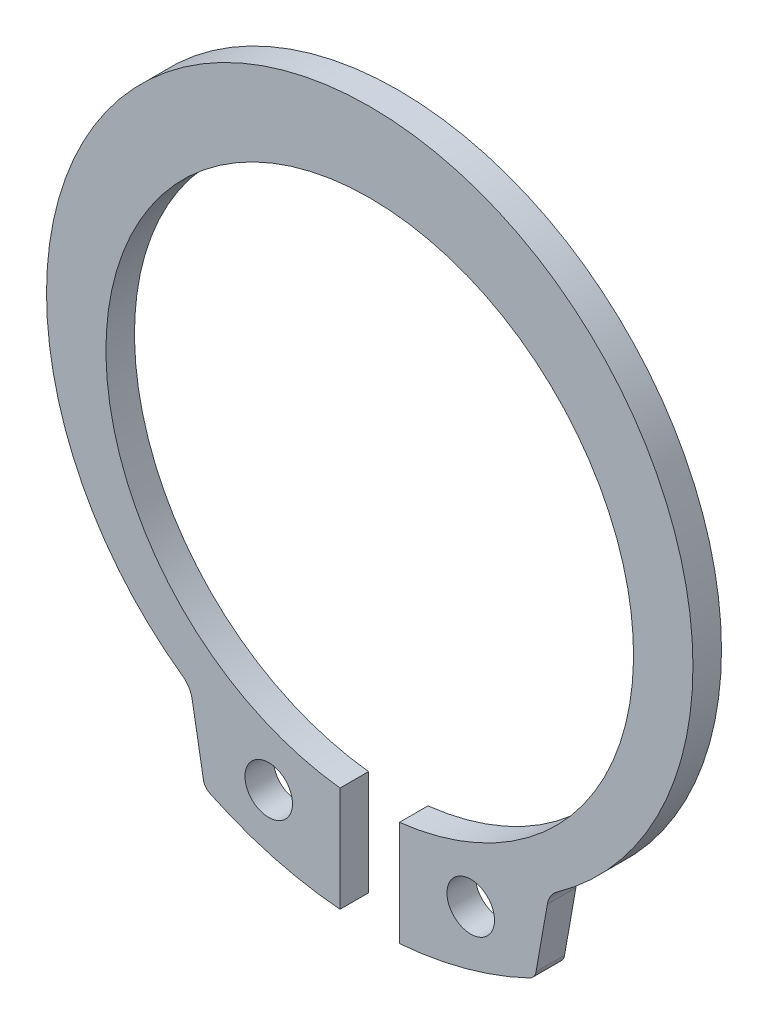
ISO-10303-21;
HEADER;
FILE_DESCRIPTION(('STEP AP214'),'2;1');
FILE_NAME('part.step','',(''),(''),'','','');
FILE_SCHEMA(('AUTOMOTIVE_DESIGN { 1 0 10303 214 1 1 1 1 }'));
ENDSEC;
DATA;
#1=APPLICATION_CONTEXT('core data for automotive mechanical design processes');
#2=APPLICATION_PROTOCOL_DEFINITION('international standard','automotive_design',2000,#1);
#3=PRODUCT_CONTEXT('',#1,'mechanical');
#4=PRODUCT('Part','Part','',(#3));
#5=PRODUCT_RELATED_PRODUCT_CATEGORY('part','',(#4));
#6=PRODUCT_DEFINITION_FORMATION('','',#4);
#7=PRODUCT_DEFINITION_CONTEXT('part definition',#1,'design');
#8=PRODUCT_DEFINITION('design','',#6,#7);
#9=PRODUCT_DEFINITION_SHAPE('','',#8);
#10=(LENGTH_UNIT() NAMED_UNIT(*) SI_UNIT(.MILLI.,.METRE.));
#11=(NAMED_UNIT(*) PLANE_ANGLE_UNIT() SI_UNIT($,.RADIAN.));
#12=(NAMED_UNIT(*) SI_UNIT($,.STERADIAN.) SOLID_ANGLE_UNIT());
#13=UNCERTAINTY_MEASURE_WITH_UNIT(LENGTH_MEASURE(1.E-05),#10,'distance_accuracy_value','');
#14=(GEOMETRIC_REPRESENTATION_CONTEXT(3) GLOBAL_UNCERTAINTY_ASSIGNED_CONTEXT((#13)) GLOBAL_UNIT_ASSIGNED_CONTEXT((#10,
#11,#12)) REPRESENTATION_CONTEXT('',''));
#15=CARTESIAN_POINT('',(0.,0.,0.));
#16=DIRECTION('',(0.,0.,1.));
#17=DIRECTION('',(1.,0.,0.));
#18=AXIS2_PLACEMENT_3D('',#15,#16,#17);
#19=CARTESIAN_POINT('',(0.,-0.2075,-0.3));
#20=DIRECTION('',(0.,0.,1.));
#21=DIRECTION('',(1.,0.,0.));
#22=AXIS2_PLACEMENT_3D('',#19,#20,#21);
#23=CYLINDRICAL_SURFACE('',#22,3.875);
#24=CARTESIAN_POINT('',(0.,-0.2075,-0.3));
#25=DIRECTION('',(0.,0.,1.));
#26=DIRECTION('',(-1.,0.,0.));
#27=AXIS2_PLACEMENT_3D('',#24,#25,#26);
#28=CIRCLE('',#27,3.875);
#29=CARTESIAN_POINT('',(0.3125,-4.06987863887009,-0.3));
#30=VERTEX_POINT('',#29);
#31=CARTESIAN_POINT('',(1.68036051645783,-3.69920639297315,-0.3));
#32=VERTEX_POINT('',#31);
#33=EDGE_CURVE('E178',#30,#32,#28,.T.);
#34=ORIENTED_EDGE('',*,*,#33,.T.);
#35=DIRECTION('',(0.,0.,1.));
#36=VECTOR('',#35,1.);
#37=CARTESIAN_POINT('',(1.68036051645783,-3.69920639297315,-0.3));
#38=LINE('',#37,#36);
#39=CARTESIAN_POINT('',(1.68036051645783,-3.69920639297315,0.));
#40=VERTEX_POINT('',#39);
#41=EDGE_CURVE('E196',#32,#40,#38,.T.);
#42=ORIENTED_EDGE('',*,*,#41,.T.);
#43=CARTESIAN_POINT('',(0.,-0.2075,0.));
#44=DIRECTION('',(0.,0.,1.));
#45=DIRECTION('',(-1.,0.,0.));
#46=AXIS2_PLACEMENT_3D('',#43,#44,#45);
#47=CIRCLE('',#46,3.875);
#48=CARTESIAN_POINT('',(0.3125,-4.06987863887009,0.));
#49=VERTEX_POINT('',#48);
#50=EDGE_CURVE('E158',#49,#40,#47,.T.);
#51=ORIENTED_EDGE('',*,*,#50,.F.);
#52=DIRECTION('',(0.,0.,1.));
#53=VECTOR('',#52,1.);
#54=CARTESIAN_POINT('',(0.3125,-4.06987863887009,-0.3));
#55=LINE('',#54,#53);
#56=EDGE_CURVE('E179',#30,#49,#55,.T.);
#57=ORIENTED_EDGE('',*,*,#56,.F.);
#58=EDGE_LOOP('',(#34,#42,#51,#57));
#59=FACE_BOUND('',#58,.T.);
#60=ADVANCED_FACE('F37',(#59),#23,.T.);
#61=CARTESIAN_POINT('',(0.3125,-2.96484813725072,-0.3));
#62=DIRECTION('',(-1.,0.,0.));
#63=DIRECTION('',(0.,-1.,0.));
#64=AXIS2_PLACEMENT_3D('',#61,#62,#63);
#65=PLANE('',#64);
#66=DIRECTION('',(0.,-1.,0.));
#67=VECTOR('',#66,1.);
#68=CARTESIAN_POINT('',(0.3125,-2.96484813725072,0.));
#69=LINE('',#68,#67);
#70=CARTESIAN_POINT('',(0.3125,-2.96484813725072,0.));
#71=VERTEX_POINT('',#70);
#72=EDGE_CURVE('E175',#71,#49,#69,.T.);
#73=ORIENTED_EDGE('',*,*,#72,.F.);
#74=DIRECTION('',(0.,0.,1.));
#75=VECTOR('',#74,1.);
#76=CARTESIAN_POINT('',(0.3125,-2.96484813725072,-0.3));
#77=LINE('',#76,#75);
#78=CARTESIAN_POINT('',(0.3125,-2.96484813725072,-0.3));
#79=VERTEX_POINT('',#78);
#80=EDGE_CURVE('E182',#79,#71,#77,.T.);
#81=ORIENTED_EDGE('',*,*,#80,.F.);
#82=DIRECTION('',(0.,-1.,0.));
#83=VECTOR('',#82,1.);
#84=CARTESIAN_POINT('',(0.3125,-2.96484813725072,-0.3));
#85=LINE('',#84,#83);
#86=EDGE_CURVE('E145',#79,#30,#85,.T.);
#87=ORIENTED_EDGE('',*,*,#86,.T.);
#88=ORIENTED_EDGE('',*,*,#56,.T.);
#89=EDGE_LOOP('',(#73,#81,#87,#88));
#90=FACE_BOUND('',#89,.T.);
#91=ADVANCED_FACE('F277',(#90),#65,.T.);
#92=CARTESIAN_POINT('',(0.,-0.2075,-0.3));
#93=DIRECTION('',(0.,0.,1.));
#94=DIRECTION('',(1.,0.,0.));
#95=AXIS2_PLACEMENT_3D('',#92,#93,#94);
#96=CYLINDRICAL_SURFACE('',#95,2.775);
#97=CARTESIAN_POINT('',(0.,-0.2075,0.));
#98=DIRECTION('',(0.,0.,-1.));
#99=DIRECTION('',(1.,0.,0.));
#100=AXIS2_PLACEMENT_3D('',#97,#98,#99);
#101=CIRCLE('',#100,2.775);
#102=CARTESIAN_POINT('',(-0.312499999999999,-2.96484813725072,0.));
#103=VERTEX_POINT('',#102);
#104=EDGE_CURVE('E172',#103,#71,#101,.T.);
#105=ORIENTED_EDGE('',*,*,#104,.F.);
#106=DIRECTION('',(0.,0.,1.));
#107=VECTOR('',#106,1.);
#108=CARTESIAN_POINT('',(-0.312499999999999,-2.96484813725072,-0.3));
#109=LINE('',#108,#107);
#110=CARTESIAN_POINT('',(-0.312499999999999,-2.96484813725072,-0.3));
#111=VERTEX_POINT('',#110);
#112=EDGE_CURVE('E144',#111,#103,#109,.T.);
#113=ORIENTED_EDGE('',*,*,#112,.F.);
#114=CARTESIAN_POINT('',(0.,-0.2075,-0.3));
#115=DIRECTION('',(0.,0.,-1.));
#116=DIRECTION('',(1.,0.,0.));
#117=AXIS2_PLACEMENT_3D('',#114,#115,#116);
#118=CIRCLE('',#117,2.775);
#119=EDGE_CURVE('E151',#111,#79,#118,.T.);
#120=ORIENTED_EDGE('',*,*,#119,.T.);
#121=ORIENTED_EDGE('',*,*,#80,.T.);
#122=EDGE_LOOP('',(#105,#113,#120,#121));
#123=FACE_BOUND('',#122,.T.);
#124=ADVANCED_FACE('F283',(#123),#96,.F.);
#125=CARTESIAN_POINT('',(-0.3125,-2.96484813725072,-0.3));
#126=DIRECTION('',(1.,0.,0.));
#127=DIRECTION('',(0.,1.,0.));
#128=AXIS2_PLACEMENT_3D('',#125,#126,#127);
#129=PLANE('',#128);
#130=DIRECTION('',(0.,1.,0.));
#131=VECTOR('',#130,1.);
#132=CARTESIAN_POINT('',(-0.3125,-2.96484813725072,0.));
#133=LINE('',#132,#131);
#134=CARTESIAN_POINT('',(-0.3125,-4.06987863887009,0.));
#135=VERTEX_POINT('',#134);
#136=EDGE_CURVE('E143',#135,#103,#133,.T.);
#137=ORIENTED_EDGE('',*,*,#136,.F.);
#138=DIRECTION('',(0.,0.,1.));
#139=VECTOR('',#138,1.);
#140=CARTESIAN_POINT('',(-0.3125,-4.06987863887009,-0.3));
#141=LINE('',#140,#139);
#142=CARTESIAN_POINT('',(-0.3125,-4.06987863887009,-0.3));
#143=VERTEX_POINT('',#142);
#144=EDGE_CURVE('E128',#143,#135,#141,.T.);
#145=ORIENTED_EDGE('',*,*,#144,.F.);
#146=DIRECTION('',(0.,1.,0.));
#147=VECTOR('',#146,1.);
#148=CARTESIAN_POINT('',(-0.3125,-2.96484813725072,-0.3));
#149=LINE('',#148,#147);
#150=EDGE_CURVE('E136',#143,#111,#149,.T.);
#151=ORIENTED_EDGE('',*,*,#150,.T.);
#152=ORIENTED_EDGE('',*,*,#112,.T.);
#153=EDGE_LOOP('',(#137,#145,#151,#152));
#154=FACE_BOUND('',#153,.T.);
#155=ADVANCED_FACE('F141',(#154),#129,.T.);
#156=CARTESIAN_POINT('',(0.,-0.2075,-0.3));
#157=DIRECTION('',(0.,0.,1.));
#158=DIRECTION('',(1.,0.,0.));
#159=AXIS2_PLACEMENT_3D('',#156,#157,#158);
#160=CYLINDRICAL_SURFACE('',#159,3.875);
#161=CARTESIAN_POINT('',(0.,-0.2075,0.));
#162=DIRECTION('',(0.,0.,1.));
#163=DIRECTION('',(1.,0.,0.));
#164=AXIS2_PLACEMENT_3D('',#161,#162,#163);
#165=CIRCLE('',#164,3.875);
#166=CARTESIAN_POINT('',(-1.68036051645783,-3.69920639297315,0.));
#167=VERTEX_POINT('',#166);
#168=EDGE_CURVE('E169',#167,#135,#165,.T.);
#169=ORIENTED_EDGE('',*,*,#168,.F.);
#170=DIRECTION('',(0.,0.,1.));
#171=VECTOR('',#170,1.);
#172=CARTESIAN_POINT('',(-1.68036051645783,-3.69920639297315,-0.3));
#173=LINE('',#172,#171);
#174=CARTESIAN_POINT('',(-1.68036051645783,-3.69920639297315,-0.3));
#175=VERTEX_POINT('',#174);
#176=EDGE_CURVE('E131',#167,#175,#173,.F.);
#177=ORIENTED_EDGE('',*,*,#176,.T.);
#178=CARTESIAN_POINT('',(0.,-0.2075,-0.3));
#179=DIRECTION('',(0.,0.,1.));
#180=DIRECTION('',(1.,0.,0.));
#181=AXIS2_PLACEMENT_3D('',#178,#179,#180);
#182=CIRCLE('',#181,3.875);
#183=EDGE_CURVE('E124',#175,#143,#182,.T.);
#184=ORIENTED_EDGE('',*,*,#183,.T.);
#185=ORIENTED_EDGE('',*,*,#144,.T.);
#186=EDGE_LOOP('',(#169,#177,#184,#185));
#187=FACE_BOUND('',#186,.T.);
#188=ADVANCED_FACE('F127',(#187),#160,.T.);
#189=CARTESIAN_POINT('',(-1.88676064825309,-2.82845085801461,-0.3));
#190=DIRECTION('',(-0.984807753012208,-0.173648177666931,0.));
#191=DIRECTION('',(0.173648177666931,-0.984807753012208,0.));
#192=AXIS2_PLACEMENT_3D('',#189,#190,#191);
#193=PLANE('',#192);
#194=DIRECTION('',(0.173648177666931,-0.984807753012208,0.));
#195=VECTOR('',#194,1.);
#196=CARTESIAN_POINT('',(-1.88676064825309,-2.82845085801461,0.));
#197=LINE('',#196,#195);
#198=CARTESIAN_POINT('',(-1.86858853891758,-2.9315100113132,0.));
#199=VERTEX_POINT('',#198);
#200=CARTESIAN_POINT('',(-1.7492563076341,-3.60827672508561,0.));
#201=VERTEX_POINT('',#200);
#202=EDGE_CURVE('E167',#199,#201,#197,.T.);
#203=ORIENTED_EDGE('',*,*,#202,.F.);
#204=DIRECTION('',(0.,0.,-1.));
#205=VECTOR('',#204,1.);
#206=CARTESIAN_POINT('',(-1.86858853891758,-2.9315100113132,-0.3));
#207=LINE('',#206,#205);
#208=CARTESIAN_POINT('',(-1.86858853891758,-2.9315100113132,-0.3));
#209=VERTEX_POINT('',#208);
#210=EDGE_CURVE('E58',#199,#209,#207,.T.);
#211=ORIENTED_EDGE('',*,*,#210,.T.);
#212=DIRECTION('',(0.173648177666931,-0.984807753012208,0.));
#213=VECTOR('',#212,1.);
#214=CARTESIAN_POINT('',(-1.88676064825309,-2.82845085801461,-0.3));
#215=LINE('',#214,#213);
#216=CARTESIAN_POINT('',(-1.7492563076341,-3.60827672508561,-0.3));
#217=VERTEX_POINT('',#216);
#218=EDGE_CURVE('E137',#209,#217,#215,.T.);
#219=ORIENTED_EDGE('',*,*,#218,.T.);
#220=DIRECTION('',(0.,0.,1.));
#221=VECTOR('',#220,1.);
#222=CARTESIAN_POINT('',(-1.7492563076341,-3.60827672508561,-0.3));
#223=LINE('',#222,#221);
#224=EDGE_CURVE('E181',#217,#201,#223,.T.);
#225=ORIENTED_EDGE('',*,*,#224,.T.);
#226=EDGE_LOOP('',(#203,#211,#219,#225));
#227=FACE_BOUND('',#226,.T.);
#228=ADVANCED_FACE('F356',(#227),#193,.T.);
#229=CARTESIAN_POINT('',(0.,0.,-0.3));
#230=DIRECTION('',(0.,0.,1.));
#231=DIRECTION('',(1.,0.,0.));
#232=AXIS2_PLACEMENT_3D('',#229,#230,#231);
#233=CYLINDRICAL_SURFACE('',#232,3.4);
#234=CARTESIAN_POINT('',(0.,0.,0.));
#235=DIRECTION('',(0.,0.,1.));
#236=DIRECTION('',(1.,0.,0.));
#237=AXIS2_PLACEMENT_3D('',#234,#235,#236);
#238=CIRCLE('',#237,3.4);
#239=CARTESIAN_POINT('',(1.96994181435073,-2.77116027109089,0.));
#240=VERTEX_POINT('',#239);
#241=CARTESIAN_POINT('',(-1.96994181435073,-2.77116027109089,0.));
#242=VERTEX_POINT('',#241);
#243=EDGE_CURVE('E165',#240,#242,#238,.T.);
#244=ORIENTED_EDGE('',*,*,#243,.F.);
#245=DIRECTION('',(0.,0.,1.));
#246=VECTOR('',#245,1.);
#247=CARTESIAN_POINT('',(1.96994181435073,-2.77116027109089,-0.3));
#248=LINE('',#247,#246);
#249=CARTESIAN_POINT('',(1.96994181435073,-2.77116027109089,-0.3));
#250=VERTEX_POINT('',#249);
#251=EDGE_CURVE('E207',#240,#250,#248,.F.);
#252=ORIENTED_EDGE('',*,*,#251,.T.);
#253=CARTESIAN_POINT('',(0.,0.,-0.3));
#254=DIRECTION('',(0.,0.,1.));
#255=DIRECTION('',(1.,0.,0.));
#256=AXIS2_PLACEMENT_3D('',#253,#254,#255);
#257=CIRCLE('',#256,3.4);
#258=CARTESIAN_POINT('',(-1.96994181435073,-2.77116027109089,-0.3));
#259=VERTEX_POINT('',#258);
#260=EDGE_CURVE('E220',#250,#259,#257,.T.);
#261=ORIENTED_EDGE('',*,*,#260,.T.);
#262=DIRECTION('',(0.,0.,1.));
#263=VECTOR('',#262,1.);
#264=CARTESIAN_POINT('',(-1.96994181435073,-2.77116027109089,-0.3));
#265=LINE('',#264,#263);
#266=EDGE_CURVE('E204',#259,#242,#265,.T.);
#267=ORIENTED_EDGE('',*,*,#266,.T.);
#268=EDGE_LOOP('',(#244,#252,#261,#267));
#269=FACE_BOUND('',#268,.T.);
#270=ADVANCED_FACE('F233',(#269),#233,.T.);
#271=CARTESIAN_POINT('',(1.88676064825309,-2.82845085801461,-0.3));
#272=DIRECTION('',(0.984807753012208,-0.173648177666931,0.));
#273=DIRECTION('',(0.173648177666931,0.984807753012208,0.));
#274=AXIS2_PLACEMENT_3D('',#271,#272,#273);
#275=PLANE('',#274);
#276=DIRECTION('',(0.173648177666931,0.984807753012208,0.));
#277=VECTOR('',#276,1.);
#278=CARTESIAN_POINT('',(1.88676064825309,-2.82845085801461,-0.3));
#279=LINE('',#278,#277);
#280=CARTESIAN_POINT('',(1.7492563076341,-3.60827672508561,-0.3));
#281=VERTEX_POINT('',#280);
#282=CARTESIAN_POINT('',(1.86858853891758,-2.9315100113132,-0.3));
#283=VERTEX_POINT('',#282);
#284=EDGE_CURVE('E217',#281,#283,#279,.T.);
#285=ORIENTED_EDGE('',*,*,#284,.T.);
#286=DIRECTION('',(0.,0.,-1.));
#287=VECTOR('',#286,1.);
#288=CARTESIAN_POINT('',(1.86858853891758,-2.9315100113132,0.));
#289=LINE('',#288,#287);
#290=CARTESIAN_POINT('',(1.86858853891758,-2.9315100113132,0.));
#291=VERTEX_POINT('',#290);
#292=EDGE_CURVE('E201',#283,#291,#289,.F.);
#293=ORIENTED_EDGE('',*,*,#292,.T.);
#294=DIRECTION('',(0.173648177666931,0.984807753012208,0.));
#295=VECTOR('',#294,1.);
#296=CARTESIAN_POINT('',(1.88676064825309,-2.82845085801461,0.));
#297=LINE('',#296,#295);
#298=CARTESIAN_POINT('',(1.7492563076341,-3.60827672508561,0.));
#299=VERTEX_POINT('',#298);
#300=EDGE_CURVE('E161',#299,#291,#297,.T.);
#301=ORIENTED_EDGE('',*,*,#300,.F.);
#302=DIRECTION('',(0.,0.,1.));
#303=VECTOR('',#302,1.);
#304=CARTESIAN_POINT('',(1.7492563076341,-3.60827672508561,-0.3));
#305=LINE('',#304,#303);
#306=EDGE_CURVE('E199',#299,#281,#305,.F.);
#307=ORIENTED_EDGE('',*,*,#306,.T.);
#308=EDGE_LOOP('',(#285,#293,#301,#307));
#309=FACE_BOUND('',#308,.T.);
#310=ADVANCED_FACE('F225',(#309),#275,.T.);
#311=CARTESIAN_POINT('',(0.,-0.2075,-0.3));
#312=DIRECTION('',(0.,0.,-1.));
#313=DIRECTION('',(-1.,0.,0.));
#314=AXIS2_PLACEMENT_3D('',#311,#312,#313);
#315=PLANE('',#314);
#316=CARTESIAN_POINT('',(1.0625,-3.35816957169425,-0.3));
#317=DIRECTION('',(0.,0.,1.));
#318=DIRECTION('',(-1.,0.,0.));
#319=AXIS2_PLACEMENT_3D('',#316,#317,#318);
#320=CIRCLE('',#319,0.25);
#321=CARTESIAN_POINT('',(0.8125,-3.35816957169425,-0.3));
#322=VERTEX_POINT('',#321);
#323=EDGE_CURVE('E245',#322,#322,#320,.T.);
#324=ORIENTED_EDGE('',*,*,#323,.T.);
#325=EDGE_LOOP('',(#324));
#326=FACE_BOUND('',#325,.T.);
#327=CARTESIAN_POINT('',(-1.0625,-3.35816957169425,-0.3));
#328=DIRECTION('',(0.,0.,1.));
#329=DIRECTION('',(1.,0.,0.));
#330=AXIS2_PLACEMENT_3D('',#327,#328,#329);
#331=CIRCLE('',#330,0.25);
#332=CARTESIAN_POINT('',(-0.8125,-3.35816957169425,-0.3));
#333=VERTEX_POINT('',#332);
#334=EDGE_CURVE('E162',#333,#333,#331,.T.);
#335=ORIENTED_EDGE('',*,*,#334,.T.);
#336=EDGE_LOOP('',(#335));
#337=FACE_BOUND('',#336,.T.);
#338=ORIENTED_EDGE('',*,*,#183,.F.);
#339=CARTESIAN_POINT('',(-1.62615533850758,-3.58657070287724,-0.3));
#340=DIRECTION('',(0.,0.,-1.));
#341=DIRECTION('',(-1.,0.,0.));
#342=AXIS2_PLACEMENT_3D('',#339,#340,#341);
#343=CIRCLE('',#342,0.125);
#344=EDGE_CURVE('E194',#175,#217,#343,.T.);
#345=ORIENTED_EDGE('',*,*,#344,.T.);
#346=ORIENTED_EDGE('',*,*,#218,.F.);
#347=CARTESIAN_POINT('',(-2.11479047717063,-2.97492205572993,-0.3));
#348=DIRECTION('',(0.,0.,-1.));
#349=DIRECTION('',(-1.,0.,0.));
#350=AXIS2_PLACEMENT_3D('',#347,#348,#349);
#351=CIRCLE('',#350,0.25);
#352=EDGE_CURVE('E11',#209,#259,#351,.F.);
#353=ORIENTED_EDGE('',*,*,#352,.T.);
#354=ORIENTED_EDGE('',*,*,#260,.F.);
#355=CARTESIAN_POINT('',(2.11479047717063,-2.97492205572993,-0.3));
#356=DIRECTION('',(0.,0.,-1.));
#357=DIRECTION('',(-1.,0.,0.));
#358=AXIS2_PLACEMENT_3D('',#355,#356,#357);
#359=CIRCLE('',#358,0.25);
#360=EDGE_CURVE('E212',#250,#283,#359,.F.);
#361=ORIENTED_EDGE('',*,*,#360,.T.);
#362=ORIENTED_EDGE('',*,*,#284,.F.);
#363=CARTESIAN_POINT('',(1.62615533850758,-3.58657070287724,-0.3));
#364=DIRECTION('',(0.,0.,-1.));
#365=DIRECTION('',(-1.,0.,0.));
#366=AXIS2_PLACEMENT_3D('',#363,#364,#365);
#367=CIRCLE('',#366,0.125);
#368=EDGE_CURVE('E192',#281,#32,#367,.T.);
#369=ORIENTED_EDGE('',*,*,#368,.T.);
#370=ORIENTED_EDGE('',*,*,#33,.F.);
#371=ORIENTED_EDGE('',*,*,#86,.F.);
#372=ORIENTED_EDGE('',*,*,#119,.F.);
#373=ORIENTED_EDGE('',*,*,#150,.F.);
#374=EDGE_LOOP('',(#338,#345,#346,#353,#354,#361,#362,#369,#370,#371,#372,#373));
#375=FACE_BOUND('',#374,.T.);
#376=ADVANCED_FACE('F148',(#326,#337,#375),#315,.T.);
#377=CARTESIAN_POINT('',(0.,-0.2075,0.));
#378=DIRECTION('',(0.,0.,-1.));
#379=DIRECTION('',(-1.,0.,0.));
#380=AXIS2_PLACEMENT_3D('',#377,#378,#379);
#381=PLANE('',#380);
#382=CARTESIAN_POINT('',(1.0625,-3.35816957169425,0.));
#383=DIRECTION('',(0.,0.,1.));
#384=DIRECTION('',(-1.,0.,0.));
#385=AXIS2_PLACEMENT_3D('',#382,#383,#384);
#386=CIRCLE('',#385,0.25);
#387=CARTESIAN_POINT('',(0.8125,-3.35816957169425,0.));
#388=VERTEX_POINT('',#387);
#389=EDGE_CURVE('E248',#388,#388,#386,.T.);
#390=ORIENTED_EDGE('',*,*,#389,.F.);
#391=EDGE_LOOP('',(#390));
#392=FACE_BOUND('',#391,.T.);
#393=CARTESIAN_POINT('',(-1.0625,-3.35816957169425,0.));
#394=DIRECTION('',(0.,0.,1.));
#395=DIRECTION('',(1.,0.,0.));
#396=AXIS2_PLACEMENT_3D('',#393,#394,#395);
#397=CIRCLE('',#396,0.25);
#398=CARTESIAN_POINT('',(-0.8125,-3.35816957169425,0.));
#399=VERTEX_POINT('',#398);
#400=EDGE_CURVE('E242',#399,#399,#397,.T.);
#401=ORIENTED_EDGE('',*,*,#400,.F.);
#402=EDGE_LOOP('',(#401));
#403=FACE_BOUND('',#402,.T.);
#404=ORIENTED_EDGE('',*,*,#243,.T.);
#405=CARTESIAN_POINT('',(-2.11479047717063,-2.97492205572993,0.));
#406=DIRECTION('',(0.,0.,-1.));
#407=DIRECTION('',(-1.,0.,0.));
#408=AXIS2_PLACEMENT_3D('',#405,#406,#407);
#409=CIRCLE('',#408,0.25);
#410=EDGE_CURVE('E45',#242,#199,#409,.T.);
#411=ORIENTED_EDGE('',*,*,#410,.T.);
#412=ORIENTED_EDGE('',*,*,#202,.T.);
#413=CARTESIAN_POINT('',(-1.62615533850758,-3.58657070287724,0.));
#414=DIRECTION('',(0.,0.,-1.));
#415=DIRECTION('',(-1.,0.,0.));
#416=AXIS2_PLACEMENT_3D('',#413,#414,#415);
#417=CIRCLE('',#416,0.125);
#418=EDGE_CURVE('E189',#201,#167,#417,.F.);
#419=ORIENTED_EDGE('',*,*,#418,.T.);
#420=ORIENTED_EDGE('',*,*,#168,.T.);
#421=ORIENTED_EDGE('',*,*,#136,.T.);
#422=ORIENTED_EDGE('',*,*,#104,.T.);
#423=ORIENTED_EDGE('',*,*,#72,.T.);
#424=ORIENTED_EDGE('',*,*,#50,.T.);
#425=CARTESIAN_POINT('',(1.62615533850758,-3.58657070287724,0.));
#426=DIRECTION('',(0.,0.,-1.));
#427=DIRECTION('',(-1.,0.,0.));
#428=AXIS2_PLACEMENT_3D('',#425,#426,#427);
#429=CIRCLE('',#428,0.125);
#430=EDGE_CURVE('E187',#40,#299,#429,.F.);
#431=ORIENTED_EDGE('',*,*,#430,.T.);
#432=ORIENTED_EDGE('',*,*,#300,.T.);
#433=CARTESIAN_POINT('',(2.11479047717063,-2.97492205572993,0.));
#434=DIRECTION('',(0.,0.,-1.));
#435=DIRECTION('',(-1.,0.,0.));
#436=AXIS2_PLACEMENT_3D('',#433,#434,#435);
#437=CIRCLE('',#436,0.25);
#438=EDGE_CURVE('E210',#291,#240,#437,.T.);
#439=ORIENTED_EDGE('',*,*,#438,.T.);
#440=EDGE_LOOP('',(#404,#411,#412,#419,#420,#421,#422,#423,#424,#431,#432,#439));
#441=FACE_BOUND('',#440,.T.);
#442=ADVANCED_FACE('F231',(#392,#403,#441),#381,.F.);
#443=CARTESIAN_POINT('',(-1.0625,-3.35816957169425,-0.3));
#444=DIRECTION('',(0.,0.,1.));
#445=DIRECTION('',(1.,0.,0.));
#446=AXIS2_PLACEMENT_3D('',#443,#444,#445);
#447=CYLINDRICAL_SURFACE('',#446,0.25);
#448=ORIENTED_EDGE('',*,*,#334,.F.);
#449=EDGE_LOOP('',(#448));
#450=FACE_BOUND('',#449,.T.);
#451=ORIENTED_EDGE('',*,*,#400,.T.);
#452=EDGE_LOOP('',(#451));
#453=FACE_BOUND('',#452,.T.);
#454=ADVANCED_FACE('F260',(#450,#453),#447,.F.);
#455=CARTESIAN_POINT('',(1.0625,-3.35816957169425,-0.3));
#456=DIRECTION('',(0.,0.,1.));
#457=DIRECTION('',(1.,0.,0.));
#458=AXIS2_PLACEMENT_3D('',#455,#456,#457);
#459=CYLINDRICAL_SURFACE('',#458,0.25);
#460=ORIENTED_EDGE('',*,*,#323,.F.);
#461=EDGE_LOOP('',(#460));
#462=FACE_BOUND('',#461,.T.);
#463=ORIENTED_EDGE('',*,*,#389,.T.);
#464=EDGE_LOOP('',(#463));
#465=FACE_BOUND('',#464,.T.);
#466=ADVANCED_FACE('F256',(#462,#465),#459,.F.);
#467=CARTESIAN_POINT('',(-1.62615533850758,-3.58657070287724,-0.3));
#468=DIRECTION('',(0.,0.,1.));
#469=DIRECTION('',(1.,0.,0.));
#470=AXIS2_PLACEMENT_3D('',#467,#468,#469);
#471=CYLINDRICAL_SURFACE('',#470,0.125);
#472=ORIENTED_EDGE('',*,*,#344,.F.);
#473=ORIENTED_EDGE('',*,*,#176,.F.);
#474=ORIENTED_EDGE('',*,*,#418,.F.);
#475=ORIENTED_EDGE('',*,*,#224,.F.);
#476=EDGE_LOOP('',(#472,#473,#474,#475));
#477=FACE_BOUND('',#476,.T.);
#478=ADVANCED_FACE('F259',(#477),#471,.T.);
#479=CARTESIAN_POINT('',(1.62615533850758,-3.58657070287724,-0.3));
#480=DIRECTION('',(0.,0.,1.));
#481=DIRECTION('',(1.,0.,0.));
#482=AXIS2_PLACEMENT_3D('',#479,#480,#481);
#483=CYLINDRICAL_SURFACE('',#482,0.125);
#484=ORIENTED_EDGE('',*,*,#368,.F.);
#485=ORIENTED_EDGE('',*,*,#306,.F.);
#486=ORIENTED_EDGE('',*,*,#430,.F.);
#487=ORIENTED_EDGE('',*,*,#41,.F.);
#488=EDGE_LOOP('',(#484,#485,#486,#487));
#489=FACE_BOUND('',#488,.T.);
#490=ADVANCED_FACE('F291',(#489),#483,.T.);
#491=CARTESIAN_POINT('',(2.11479047717063,-2.97492205572993,-0.3));
#492=DIRECTION('',(0.,0.,1.));
#493=DIRECTION('',(1.,0.,0.));
#494=AXIS2_PLACEMENT_3D('',#491,#492,#493);
#495=CYLINDRICAL_SURFACE('',#494,0.25);
#496=ORIENTED_EDGE('',*,*,#360,.F.);
#497=ORIENTED_EDGE('',*,*,#251,.F.);
#498=ORIENTED_EDGE('',*,*,#438,.F.);
#499=ORIENTED_EDGE('',*,*,#292,.F.);
#500=EDGE_LOOP('',(#496,#497,#498,#499));
#501=FACE_BOUND('',#500,.T.);
#502=ADVANCED_FACE('F229',(#501),#495,.F.);
#503=CARTESIAN_POINT('',(-2.11479047717063,-2.97492205572993,-0.3));
#504=DIRECTION('',(0.,0.,1.));
#505=DIRECTION('',(1.,0.,0.));
#506=AXIS2_PLACEMENT_3D('',#503,#504,#505);
#507=CYLINDRICAL_SURFACE('',#506,0.25);
#508=ORIENTED_EDGE('',*,*,#352,.F.);
#509=ORIENTED_EDGE('',*,*,#210,.F.);
#510=ORIENTED_EDGE('',*,*,#410,.F.);
#511=ORIENTED_EDGE('',*,*,#266,.F.);
#512=EDGE_LOOP('',(#508,#509,#510,#511));
#513=FACE_BOUND('',#512,.T.);
#514=ADVANCED_FACE('F39',(#513),#507,.F.);
#515=CLOSED_SHELL('',(#60,#91,#124,#155,#188,#228,#270,#310,#376,#442,#454,#466,#478,#490,#502,#514));
#516=MANIFOLD_SOLID_BREP('B2',#515);
#517=ADVANCED_BREP_SHAPE_REPRESENTATION('',(#18,#516),#14);
#518=SHAPE_DEFINITION_REPRESENTATION(#9,#517);
ENDSEC;
END-ISO-10303-21;
